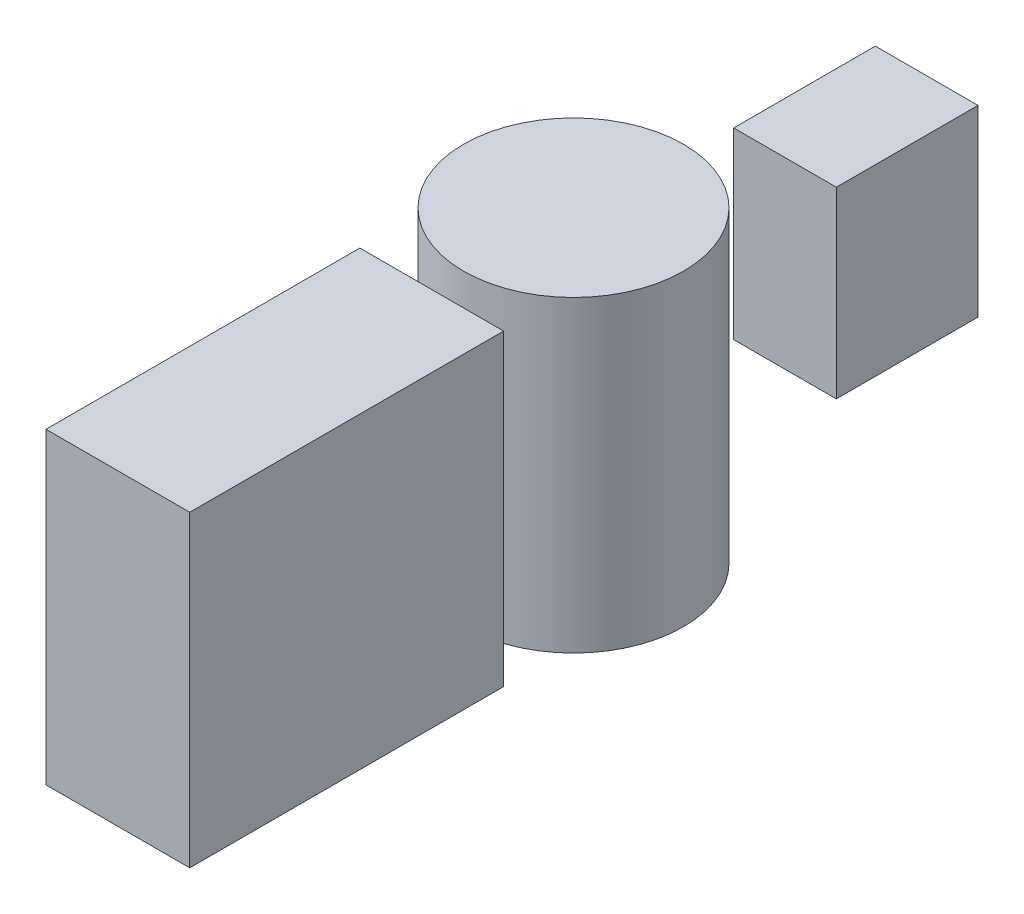
ISO-10303-21;
HEADER;
FILE_DESCRIPTION(('STEP AP214'),'2;1');
FILE_NAME('part.step','',(''),(''),'','','');
FILE_SCHEMA(('AUTOMOTIVE_DESIGN { 1 0 10303 214 1 1 1 1 }'));
ENDSEC;
DATA;
#1=APPLICATION_CONTEXT('core data for automotive mechanical design processes');
#2=APPLICATION_PROTOCOL_DEFINITION('international standard','automotive_design',2000,#1);
#3=PRODUCT_CONTEXT('',#1,'mechanical');
#4=PRODUCT('Part','Part','',(#3));
#5=PRODUCT_RELATED_PRODUCT_CATEGORY('part','',(#4));
#6=PRODUCT_DEFINITION_FORMATION('','',#4);
#7=PRODUCT_DEFINITION_CONTEXT('part definition',#1,'design');
#8=PRODUCT_DEFINITION('design','',#6,#7);
#9=PRODUCT_DEFINITION_SHAPE('','',#8);
#10=(LENGTH_UNIT() NAMED_UNIT(*) SI_UNIT(.MILLI.,.METRE.));
#11=(NAMED_UNIT(*) PLANE_ANGLE_UNIT() SI_UNIT($,.RADIAN.));
#12=(NAMED_UNIT(*) SI_UNIT($,.STERADIAN.) SOLID_ANGLE_UNIT());
#13=UNCERTAINTY_MEASURE_WITH_UNIT(LENGTH_MEASURE(1.E-05),#10,'distance_accuracy_value','');
#14=(GEOMETRIC_REPRESENTATION_CONTEXT(3) GLOBAL_UNCERTAINTY_ASSIGNED_CONTEXT((#13)) GLOBAL_UNIT_ASSIGNED_CONTEXT((#10,
#11,#12)) REPRESENTATION_CONTEXT('',''));
#15=CARTESIAN_POINT('',(0.,0.,0.));
#16=DIRECTION('',(0.,0.,1.));
#17=DIRECTION('',(1.,0.,0.));
#18=AXIS2_PLACEMENT_3D('',#15,#16,#17);
#19=CARTESIAN_POINT('',(17.7812438989782,38.1,35.0777546513712));
#20=DIRECTION('',(-1.,0.,0.));
#21=DIRECTION('',(0.,0.,1.));
#22=AXIS2_PLACEMENT_3D('',#19,#20,#21);
#23=PLANE('',#22);
#24=DIRECTION('',(0.,0.,-1.));
#25=VECTOR('',#24,1.);
#26=CARTESIAN_POINT('',(17.7812438989782,-38.1,35.0777546513712));
#27=LINE('',#26,#25);
#28=CARTESIAN_POINT('',(17.7812438989782,-38.1,112.735559546558));
#29=VERTEX_POINT('',#28);
#30=CARTESIAN_POINT('',(17.7812438989782,-38.1,35.0777546513712));
#31=VERTEX_POINT('',#30);
#32=EDGE_CURVE('E109',#29,#31,#27,.T.);
#33=ORIENTED_EDGE('',*,*,#32,.T.);
#34=DIRECTION('',(0.,-1.,0.));
#35=VECTOR('',#34,1.);
#36=CARTESIAN_POINT('',(17.7812438989782,38.1,35.0777546513712));
#37=LINE('',#36,#35);
#38=CARTESIAN_POINT('',(17.7812438989782,38.1,35.0777546513712));
#39=VERTEX_POINT('',#38);
#40=EDGE_CURVE('E12',#39,#31,#37,.T.);
#41=ORIENTED_EDGE('',*,*,#40,.F.);
#42=DIRECTION('',(0.,0.,-1.));
#43=VECTOR('',#42,1.);
#44=CARTESIAN_POINT('',(17.7812438989782,38.1,35.0777546513712));
#45=LINE('',#44,#43);
#46=CARTESIAN_POINT('',(17.7812438989782,38.1,112.735559546558));
#47=VERTEX_POINT('',#46);
#48=EDGE_CURVE('E97',#47,#39,#45,.T.);
#49=ORIENTED_EDGE('',*,*,#48,.F.);
#50=DIRECTION('',(0.,-1.,0.));
#51=VECTOR('',#50,1.);
#52=CARTESIAN_POINT('',(17.7812438989782,38.1,112.735559546558));
#53=LINE('',#52,#51);
#54=EDGE_CURVE('E105',#47,#29,#53,.T.);
#55=ORIENTED_EDGE('',*,*,#54,.T.);
#56=EDGE_LOOP('',(#33,#41,#49,#55));
#57=FACE_BOUND('',#56,.T.);
#58=ADVANCED_FACE('F46',(#57),#23,.F.);
#59=CARTESIAN_POINT('',(-17.7812438989781,38.1,35.0777546513712));
#60=DIRECTION('',(0.,0.,1.));
#61=DIRECTION('',(1.,0.,0.));
#62=AXIS2_PLACEMENT_3D('',#59,#60,#61);
#63=PLANE('',#62);
#64=DIRECTION('',(-1.,0.,0.));
#65=VECTOR('',#64,1.);
#66=CARTESIAN_POINT('',(-17.7812438989781,-38.1,35.0777546513712));
#67=LINE('',#66,#65);
#68=CARTESIAN_POINT('',(-17.7812438989781,-38.1,35.0777546513712));
#69=VERTEX_POINT('',#68);
#70=EDGE_CURVE('E101',#31,#69,#67,.T.);
#71=ORIENTED_EDGE('',*,*,#70,.T.);
#72=DIRECTION('',(0.,-1.,0.));
#73=VECTOR('',#72,1.);
#74=CARTESIAN_POINT('',(-17.7812438989781,38.1,35.0777546513712));
#75=LINE('',#74,#73);
#76=CARTESIAN_POINT('',(-17.7812438989781,38.1,35.0777546513712));
#77=VERTEX_POINT('',#76);
#78=EDGE_CURVE('E54',#77,#69,#75,.T.);
#79=ORIENTED_EDGE('',*,*,#78,.F.);
#80=DIRECTION('',(-1.,0.,0.));
#81=VECTOR('',#80,1.);
#82=CARTESIAN_POINT('',(-17.7812438989781,38.1,35.0777546513712));
#83=LINE('',#82,#81);
#84=EDGE_CURVE('E92',#39,#77,#83,.T.);
#85=ORIENTED_EDGE('',*,*,#84,.F.);
#86=ORIENTED_EDGE('',*,*,#40,.T.);
#87=EDGE_LOOP('',(#71,#79,#85,#86));
#88=FACE_BOUND('',#87,.T.);
#89=ADVANCED_FACE('F100',(#88),#63,.F.);
#90=CARTESIAN_POINT('',(-17.7812438989781,38.1,35.0777546513712));
#91=DIRECTION('',(1.,0.,0.));
#92=DIRECTION('',(0.,0.,-1.));
#93=AXIS2_PLACEMENT_3D('',#90,#91,#92);
#94=PLANE('',#93);
#95=DIRECTION('',(0.,0.,1.));
#96=VECTOR('',#95,1.);
#97=CARTESIAN_POINT('',(-17.7812438989781,-38.1,35.0777546513712));
#98=LINE('',#97,#96);
#99=CARTESIAN_POINT('',(-17.7812438989781,-38.1,112.735559546558));
#100=VERTEX_POINT('',#99);
#101=EDGE_CURVE('E79',#69,#100,#98,.T.);
#102=ORIENTED_EDGE('',*,*,#101,.T.);
#103=DIRECTION('',(0.,-1.,0.));
#104=VECTOR('',#103,1.);
#105=CARTESIAN_POINT('',(-17.7812438989781,38.1,112.735559546558));
#106=LINE('',#105,#104);
#107=CARTESIAN_POINT('',(-17.7812438989781,38.1,112.735559546558));
#108=VERTEX_POINT('',#107);
#109=EDGE_CURVE('E102',#108,#100,#106,.T.);
#110=ORIENTED_EDGE('',*,*,#109,.F.);
#111=DIRECTION('',(0.,0.,1.));
#112=VECTOR('',#111,1.);
#113=CARTESIAN_POINT('',(-17.7812438989781,38.1,35.0777546513712));
#114=LINE('',#113,#112);
#115=EDGE_CURVE('E95',#77,#108,#114,.T.);
#116=ORIENTED_EDGE('',*,*,#115,.F.);
#117=ORIENTED_EDGE('',*,*,#78,.T.);
#118=EDGE_LOOP('',(#102,#110,#116,#117));
#119=FACE_BOUND('',#118,.T.);
#120=ADVANCED_FACE('F103',(#119),#94,.F.);
#121=CARTESIAN_POINT('',(-17.7812438989781,38.1,112.735559546558));
#122=DIRECTION('',(0.,0.,-1.));
#123=DIRECTION('',(-1.,0.,0.));
#124=AXIS2_PLACEMENT_3D('',#121,#122,#123);
#125=PLANE('',#124);
#126=DIRECTION('',(1.,0.,0.));
#127=VECTOR('',#126,1.);
#128=CARTESIAN_POINT('',(-17.7812438989781,-38.1,112.735559546558));
#129=LINE('',#128,#127);
#130=EDGE_CURVE('E85',#100,#29,#129,.T.);
#131=ORIENTED_EDGE('',*,*,#130,.T.);
#132=ORIENTED_EDGE('',*,*,#54,.F.);
#133=DIRECTION('',(1.,0.,0.));
#134=VECTOR('',#133,1.);
#135=CARTESIAN_POINT('',(-17.7812438989781,38.1,112.735559546558));
#136=LINE('',#135,#134);
#137=EDGE_CURVE('E62',#108,#47,#136,.T.);
#138=ORIENTED_EDGE('',*,*,#137,.F.);
#139=ORIENTED_EDGE('',*,*,#109,.T.);
#140=EDGE_LOOP('',(#131,#132,#138,#139));
#141=FACE_BOUND('',#140,.T.);
#142=ADVANCED_FACE('F116',(#141),#125,.F.);
#143=CARTESIAN_POINT('',(0.,38.1,0.));
#144=DIRECTION('',(0.,1.,0.));
#145=DIRECTION('',(0.,0.,1.));
#146=AXIS2_PLACEMENT_3D('',#143,#144,#145);
#147=PLANE('',#146);
#148=ORIENTED_EDGE('',*,*,#48,.T.);
#149=ORIENTED_EDGE('',*,*,#84,.T.);
#150=ORIENTED_EDGE('',*,*,#115,.T.);
#151=ORIENTED_EDGE('',*,*,#137,.T.);
#152=EDGE_LOOP('',(#148,#149,#150,#151));
#153=FACE_BOUND('',#152,.T.);
#154=ADVANCED_FACE('F93',(#153),#147,.T.);
#155=CARTESIAN_POINT('',(0.,-38.1,0.));
#156=DIRECTION('',(0.,1.,0.));
#157=DIRECTION('',(0.,0.,1.));
#158=AXIS2_PLACEMENT_3D('',#155,#156,#157);
#159=PLANE('',#158);
#160=ORIENTED_EDGE('',*,*,#32,.F.);
#161=ORIENTED_EDGE('',*,*,#130,.F.);
#162=ORIENTED_EDGE('',*,*,#101,.F.);
#163=ORIENTED_EDGE('',*,*,#70,.F.);
#164=EDGE_LOOP('',(#160,#161,#162,#163));
#165=FACE_BOUND('',#164,.T.);
#166=ADVANCED_FACE('F119',(#165),#159,.F.);
#167=CLOSED_SHELL('',(#58,#89,#120,#142,#154,#166));
#168=MANIFOLD_SOLID_BREP('B2',#167);
#169=CARTESIAN_POINT('',(0.,38.1,0.));
#170=DIRECTION('',(0.,-1.,0.));
#171=DIRECTION('',(0.,0.,-1.));
#172=AXIS2_PLACEMENT_3D('',#169,#170,#171);
#173=CYLINDRICAL_SURFACE('',#172,27.2080201574377);
#174=CARTESIAN_POINT('',(0.,38.1,0.));
#175=DIRECTION('',(0.,1.,0.));
#176=DIRECTION('',(0.,0.,1.));
#177=AXIS2_PLACEMENT_3D('',#174,#175,#176);
#178=CIRCLE('',#177,27.2080201574377);
#179=CARTESIAN_POINT('',(0.,38.1,-27.2080201574377));
#180=VERTEX_POINT('',#179);
#181=EDGE_CURVE('E45',#180,#180,#178,.T.);
#182=CARTESIAN_POINT('',(0.,-38.1,0.));
#183=DIRECTION('',(0.,1.,0.));
#184=DIRECTION('',(0.,0.,1.));
#185=AXIS2_PLACEMENT_3D('',#182,#183,#184);
#186=CIRCLE('',#185,27.2080201574377);
#187=CARTESIAN_POINT('',(0.,-38.1,-27.2080201574377));
#188=VERTEX_POINT('',#187);
#189=EDGE_CURVE('E182',#188,#188,#186,.T.);
#190=CARTESIAN_POINT('',(0.,38.1,-27.2080201574377));
#191=CARTESIAN_POINT('',(0.,37.30625,-27.2080201574377));
#192=CARTESIAN_POINT('',(0.,36.5125,-27.2080201574377));
#193=CARTESIAN_POINT('',(0.,34.925,-27.2080201574377));
#194=CARTESIAN_POINT('',(0.,34.13125,-27.2080201574377));
#195=CARTESIAN_POINT('',(0.,32.54375,-27.2080201574377));
#196=CARTESIAN_POINT('',(0.,31.75,-27.2080201574377));
#197=CARTESIAN_POINT('',(0.,30.1625,-27.2080201574377));
#198=CARTESIAN_POINT('',(0.,29.36875,-27.2080201574377));
#199=CARTESIAN_POINT('',(0.,27.78125,-27.2080201574377));
#200=CARTESIAN_POINT('',(0.,26.9875,-27.2080201574377));
#201=CARTESIAN_POINT('',(0.,25.4,-27.2080201574377));
#202=CARTESIAN_POINT('',(0.,24.60625,-27.2080201574377));
#203=CARTESIAN_POINT('',(0.,23.01875,-27.2080201574377));
#204=CARTESIAN_POINT('',(0.,22.225,-27.2080201574377));
#205=CARTESIAN_POINT('',(0.,20.6375,-27.2080201574377));
#206=CARTESIAN_POINT('',(0.,19.84375,-27.2080201574377));
#207=CARTESIAN_POINT('',(0.,18.25625,-27.2080201574377));
#208=CARTESIAN_POINT('',(0.,17.4625,-27.2080201574377));
#209=CARTESIAN_POINT('',(0.,15.875,-27.2080201574377));
#210=CARTESIAN_POINT('',(0.,15.08125,-27.2080201574377));
#211=CARTESIAN_POINT('',(0.,13.49375,-27.2080201574377));
#212=CARTESIAN_POINT('',(0.,12.7,-27.2080201574377));
#213=CARTESIAN_POINT('',(0.,11.1125,-27.2080201574377));
#214=CARTESIAN_POINT('',(0.,10.31875,-27.2080201574377));
#215=CARTESIAN_POINT('',(0.,8.73124999999999,-27.2080201574377));
#216=CARTESIAN_POINT('',(0.,7.93749999999999,-27.2080201574377));
#217=CARTESIAN_POINT('',(0.,6.34999999999999,-27.2080201574377));
#218=CARTESIAN_POINT('',(0.,5.55625,-27.2080201574377));
#219=CARTESIAN_POINT('',(0.,3.96875,-27.2080201574377));
#220=CARTESIAN_POINT('',(0.,3.17499999999999,-27.2080201574377));
#221=CARTESIAN_POINT('',(0.,1.58749999999999,-27.2080201574377));
#222=CARTESIAN_POINT('',(0.,0.793749999999994,-27.2080201574377));
#223=CARTESIAN_POINT('',(0.,-0.793750000000007,-27.2080201574377));
#224=CARTESIAN_POINT('',(0.,-1.58750000000001,-27.2080201574377));
#225=CARTESIAN_POINT('',(0.,-3.17500000000001,-27.2080201574377));
#226=CARTESIAN_POINT('',(0.,-3.96875000000001,-27.2080201574377));
#227=CARTESIAN_POINT('',(0.,-5.55625000000001,-27.2080201574377));
#228=CARTESIAN_POINT('',(0.,-6.35000000000001,-27.2080201574377));
#229=CARTESIAN_POINT('',(0.,-7.93750000000001,-27.2080201574377));
#230=CARTESIAN_POINT('',(0.,-8.73125000000001,-27.2080201574377));
#231=CARTESIAN_POINT('',(0.,-10.31875,-27.2080201574377));
#232=CARTESIAN_POINT('',(0.,-11.1125,-27.2080201574377));
#233=CARTESIAN_POINT('',(0.,-12.7,-27.2080201574377));
#234=CARTESIAN_POINT('',(0.,-13.49375,-27.2080201574377));
#235=CARTESIAN_POINT('',(0.,-15.08125,-27.2080201574377));
#236=CARTESIAN_POINT('',(0.,-15.875,-27.2080201574377));
#237=CARTESIAN_POINT('',(0.,-17.4625,-27.2080201574377));
#238=CARTESIAN_POINT('',(0.,-18.25625,-27.2080201574377));
#239=CARTESIAN_POINT('',(0.,-19.84375,-27.2080201574377));
#240=CARTESIAN_POINT('',(0.,-20.6375,-27.2080201574377));
#241=CARTESIAN_POINT('',(0.,-22.225,-27.2080201574377));
#242=CARTESIAN_POINT('',(0.,-23.01875,-27.2080201574377));
#243=CARTESIAN_POINT('',(0.,-24.60625,-27.2080201574377));
#244=CARTESIAN_POINT('',(0.,-25.4,-27.2080201574377));
#245=CARTESIAN_POINT('',(0.,-26.9875,-27.2080201574377));
#246=CARTESIAN_POINT('',(0.,-27.78125,-27.2080201574377));
#247=CARTESIAN_POINT('',(0.,-29.36875,-27.2080201574377));
#248=CARTESIAN_POINT('',(0.,-30.1625,-27.2080201574377));
#249=CARTESIAN_POINT('',(0.,-31.75,-27.2080201574377));
#250=CARTESIAN_POINT('',(0.,-32.54375,-27.2080201574377));
#251=CARTESIAN_POINT('',(0.,-34.13125,-27.2080201574377));
#252=CARTESIAN_POINT('',(0.,-34.925,-27.2080201574377));
#253=CARTESIAN_POINT('',(0.,-36.5125,-27.2080201574377));
#254=CARTESIAN_POINT('',(0.,-37.30625,-27.2080201574377));
#255=CARTESIAN_POINT('',(0.,-38.1,-27.2080201574377));
#256=B_SPLINE_CURVE_WITH_KNOTS('',3,(#190,#191,#192,#193,#194,#195,#196,#197,#198,#199,#200,
#201,#202,#203,#204,#205,#206,#207,#208,#209,#210,#211,#212,#213,#214,#215,#216,#217,#218,#219,
#220,#221,#222,#223,#224,#225,#226,#227,#228,#229,#230,#231,#232,#233,#234,#235,#236,#237,#238,
#239,#240,#241,#242,#243,#244,#245,#246,#247,#248,#249,#250,#251,#252,#253,#254,#255),
.UNSPECIFIED.,.F.,.F.,(4,2,2,2,2,2,2,2,2,2,2,2,2,2,2,2,2,2,2,2,2,2,2,2,2,2,2,2,2,2,2,2,4),(0.,
2.38124999999999,4.7625,7.14375,9.525,11.90625,14.2875,16.66875,19.05,21.43125,23.8125,26.19375,
28.575,30.95625,33.3375,35.71875,38.1,40.48125,42.8625,45.24375,47.625,50.00625,52.3875,
54.76875,57.15,59.53125,61.9125,64.29375,66.675,69.05625,71.4375,73.81875,76.2),.UNSPECIFIED.);
#257=EDGE_CURVE('BSEAM179',#180,#188,#256,.T.);
#258=ORIENTED_EDGE('',*,*,#181,.F.);
#259=ORIENTED_EDGE('',*,*,#189,.T.);
#260=ORIENTED_EDGE('',*,*,#257,.T.);
#261=ORIENTED_EDGE('',*,*,#257,.F.);
#262=EDGE_LOOP('',(#258,#260,#259,#261));
#263=FACE_BOUND('',#262,.T.);
#264=ADVANCED_FACE('F179',(#263),#173,.T.);
#265=CARTESIAN_POINT('',(0.,38.1,0.));
#266=DIRECTION('',(0.,1.,0.));
#267=DIRECTION('',(0.,0.,1.));
#268=AXIS2_PLACEMENT_3D('',#265,#266,#267);
#269=PLANE('',#268);
#270=ORIENTED_EDGE('',*,*,#181,.T.);
#271=EDGE_LOOP('',(#270));
#272=FACE_BOUND('',#271,.T.);
#273=ADVANCED_FACE('F194',(#272),#269,.T.);
#274=CARTESIAN_POINT('',(0.,-38.1,0.));
#275=DIRECTION('',(0.,1.,0.));
#276=DIRECTION('',(0.,0.,1.));
#277=AXIS2_PLACEMENT_3D('',#274,#275,#276);
#278=PLANE('',#277);
#279=ORIENTED_EDGE('',*,*,#189,.F.);
#280=EDGE_LOOP('',(#279));
#281=FACE_BOUND('',#280,.T.);
#282=ADVANCED_FACE('F192',(#281),#278,.F.);
#283=CLOSED_SHELL('',(#264,#273,#282));
#284=MANIFOLD_SOLID_BREP('B6',#283);
#285=CARTESIAN_POINT('',(12.7,22.6823675718026,-87.3786659868303));
#286=DIRECTION('',(0.,0.,1.));
#287=DIRECTION('',(1.,0.,0.));
#288=AXIS2_PLACEMENT_3D('',#285,#286,#287);
#289=PLANE('',#288);
#290=DIRECTION('',(0.,1.,0.));
#291=VECTOR('',#290,1.);
#292=CARTESIAN_POINT('',(-12.7,22.6823675718026,-87.3786659868303));
#293=LINE('',#292,#291);
#294=CARTESIAN_POINT('',(-12.7,-22.6823675718026,-87.3786659868303));
#295=VERTEX_POINT('',#294);
#296=CARTESIAN_POINT('',(-12.7,22.6823675718026,-87.3786659868303));
#297=VERTEX_POINT('',#296);
#298=EDGE_CURVE('E283',#295,#297,#293,.T.);
#299=ORIENTED_EDGE('',*,*,#298,.T.);
#300=DIRECTION('',(-1.,0.,0.));
#301=VECTOR('',#300,1.);
#302=CARTESIAN_POINT('',(12.7,22.6823675718026,-87.3786659868303));
#303=LINE('',#302,#301);
#304=CARTESIAN_POINT('',(12.7,22.6823675718026,-87.3786659868303));
#305=VERTEX_POINT('',#304);
#306=EDGE_CURVE('E177',#305,#297,#303,.T.);
#307=ORIENTED_EDGE('',*,*,#306,.F.);
#308=DIRECTION('',(0.,1.,0.));
#309=VECTOR('',#308,1.);
#310=CARTESIAN_POINT('',(12.7,22.6823675718026,-87.3786659868303));
#311=LINE('',#310,#309);
#312=CARTESIAN_POINT('',(12.7,-22.6823675718026,-87.3786659868303));
#313=VERTEX_POINT('',#312);
#314=EDGE_CURVE('E271',#313,#305,#311,.T.);
#315=ORIENTED_EDGE('',*,*,#314,.F.);
#316=DIRECTION('',(-1.,0.,0.));
#317=VECTOR('',#316,1.);
#318=CARTESIAN_POINT('',(12.7,-22.6823675718026,-87.3786659868303));
#319=LINE('',#318,#317);
#320=EDGE_CURVE('E279',#313,#295,#319,.T.);
#321=ORIENTED_EDGE('',*,*,#320,.T.);
#322=EDGE_LOOP('',(#299,#307,#315,#321));
#323=FACE_BOUND('',#322,.T.);
#324=ADVANCED_FACE('F220',(#323),#289,.F.);
#325=CARTESIAN_POINT('',(12.7,22.6823675718026,-52.3240979213171));
#326=DIRECTION('',(0.,-1.,0.));
#327=DIRECTION('',(0.,0.,-1.));
#328=AXIS2_PLACEMENT_3D('',#325,#326,#327);
#329=PLANE('',#328);
#330=DIRECTION('',(0.,0.,1.));
#331=VECTOR('',#330,1.);
#332=CARTESIAN_POINT('',(-12.7,22.6823675718026,-52.3240979213171));
#333=LINE('',#332,#331);
#334=CARTESIAN_POINT('',(-12.7,22.6823675718026,-52.3240979213171));
#335=VERTEX_POINT('',#334);
#336=EDGE_CURVE('E275',#297,#335,#333,.T.);
#337=ORIENTED_EDGE('',*,*,#336,.T.);
#338=DIRECTION('',(-1.,0.,0.));
#339=VECTOR('',#338,1.);
#340=CARTESIAN_POINT('',(12.7,22.6823675718026,-52.3240979213171));
#341=LINE('',#340,#339);
#342=CARTESIAN_POINT('',(12.7,22.6823675718026,-52.3240979213171));
#343=VERTEX_POINT('',#342);
#344=EDGE_CURVE('E228',#343,#335,#341,.T.);
#345=ORIENTED_EDGE('',*,*,#344,.F.);
#346=DIRECTION('',(0.,0.,1.));
#347=VECTOR('',#346,1.);
#348=CARTESIAN_POINT('',(12.7,22.6823675718026,-52.3240979213171));
#349=LINE('',#348,#347);
#350=EDGE_CURVE('E266',#305,#343,#349,.T.);
#351=ORIENTED_EDGE('',*,*,#350,.F.);
#352=ORIENTED_EDGE('',*,*,#306,.T.);
#353=EDGE_LOOP('',(#337,#345,#351,#352));
#354=FACE_BOUND('',#353,.T.);
#355=ADVANCED_FACE('F274',(#354),#329,.F.);
#356=CARTESIAN_POINT('',(12.7,22.6823675718026,-52.3240979213171));
#357=DIRECTION('',(0.,0.,-1.));
#358=DIRECTION('',(-1.,0.,0.));
#359=AXIS2_PLACEMENT_3D('',#356,#357,#358);
#360=PLANE('',#359);
#361=DIRECTION('',(0.,-1.,0.));
#362=VECTOR('',#361,1.);
#363=CARTESIAN_POINT('',(-12.7,22.6823675718026,-52.3240979213171));
#364=LINE('',#363,#362);
#365=CARTESIAN_POINT('',(-12.7,-22.6823675718026,-52.3240979213171));
#366=VERTEX_POINT('',#365);
#367=EDGE_CURVE('E253',#335,#366,#364,.T.);
#368=ORIENTED_EDGE('',*,*,#367,.T.);
#369=DIRECTION('',(-1.,0.,0.));
#370=VECTOR('',#369,1.);
#371=CARTESIAN_POINT('',(12.7,-22.6823675718026,-52.3240979213171));
#372=LINE('',#371,#370);
#373=CARTESIAN_POINT('',(12.7,-22.6823675718026,-52.3240979213171));
#374=VERTEX_POINT('',#373);
#375=EDGE_CURVE('E276',#374,#366,#372,.T.);
#376=ORIENTED_EDGE('',*,*,#375,.F.);
#377=DIRECTION('',(0.,-1.,0.));
#378=VECTOR('',#377,1.);
#379=CARTESIAN_POINT('',(12.7,22.6823675718026,-52.3240979213171));
#380=LINE('',#379,#378);
#381=EDGE_CURVE('E269',#343,#374,#380,.T.);
#382=ORIENTED_EDGE('',*,*,#381,.F.);
#383=ORIENTED_EDGE('',*,*,#344,.T.);
#384=EDGE_LOOP('',(#368,#376,#382,#383));
#385=FACE_BOUND('',#384,.T.);
#386=ADVANCED_FACE('F277',(#385),#360,.F.);
#387=CARTESIAN_POINT('',(12.7,-22.6823675718026,-52.3240979213171));
#388=DIRECTION('',(0.,1.,0.));
#389=DIRECTION('',(0.,0.,1.));
#390=AXIS2_PLACEMENT_3D('',#387,#388,#389);
#391=PLANE('',#390);
#392=DIRECTION('',(0.,0.,-1.));
#393=VECTOR('',#392,1.);
#394=CARTESIAN_POINT('',(-12.7,-22.6823675718026,-52.3240979213171));
#395=LINE('',#394,#393);
#396=EDGE_CURVE('E259',#366,#295,#395,.T.);
#397=ORIENTED_EDGE('',*,*,#396,.T.);
#398=ORIENTED_EDGE('',*,*,#320,.F.);
#399=DIRECTION('',(0.,0.,-1.));
#400=VECTOR('',#399,1.);
#401=CARTESIAN_POINT('',(12.7,-22.6823675718026,-52.3240979213171));
#402=LINE('',#401,#400);
#403=EDGE_CURVE('E236',#374,#313,#402,.T.);
#404=ORIENTED_EDGE('',*,*,#403,.F.);
#405=ORIENTED_EDGE('',*,*,#375,.T.);
#406=EDGE_LOOP('',(#397,#398,#404,#405));
#407=FACE_BOUND('',#406,.T.);
#408=ADVANCED_FACE('F290',(#407),#391,.F.);
#409=CARTESIAN_POINT('',(12.7,0.,0.));
#410=DIRECTION('',(1.,0.,0.));
#411=DIRECTION('',(0.,0.,-1.));
#412=AXIS2_PLACEMENT_3D('',#409,#410,#411);
#413=PLANE('',#412);
#414=ORIENTED_EDGE('',*,*,#314,.T.);
#415=ORIENTED_EDGE('',*,*,#350,.T.);
#416=ORIENTED_EDGE('',*,*,#381,.T.);
#417=ORIENTED_EDGE('',*,*,#403,.T.);
#418=EDGE_LOOP('',(#414,#415,#416,#417));
#419=FACE_BOUND('',#418,.T.);
#420=ADVANCED_FACE('F267',(#419),#413,.T.);
#421=CARTESIAN_POINT('',(-12.7,0.,0.));
#422=DIRECTION('',(1.,0.,0.));
#423=DIRECTION('',(0.,0.,-1.));
#424=AXIS2_PLACEMENT_3D('',#421,#422,#423);
#425=PLANE('',#424);
#426=ORIENTED_EDGE('',*,*,#298,.F.);
#427=ORIENTED_EDGE('',*,*,#396,.F.);
#428=ORIENTED_EDGE('',*,*,#367,.F.);
#429=ORIENTED_EDGE('',*,*,#336,.F.);
#430=EDGE_LOOP('',(#426,#427,#428,#429));
#431=FACE_BOUND('',#430,.T.);
#432=ADVANCED_FACE('F293',(#431),#425,.F.);
#433=CLOSED_SHELL('',(#324,#355,#386,#408,#420,#432));
#434=MANIFOLD_SOLID_BREP('B40',#433);
#435=ADVANCED_BREP_SHAPE_REPRESENTATION('',(#18,#168,#284,#434),#14);
#436=SHAPE_DEFINITION_REPRESENTATION(#9,#435);
ENDSEC;
END-ISO-10303-21;
